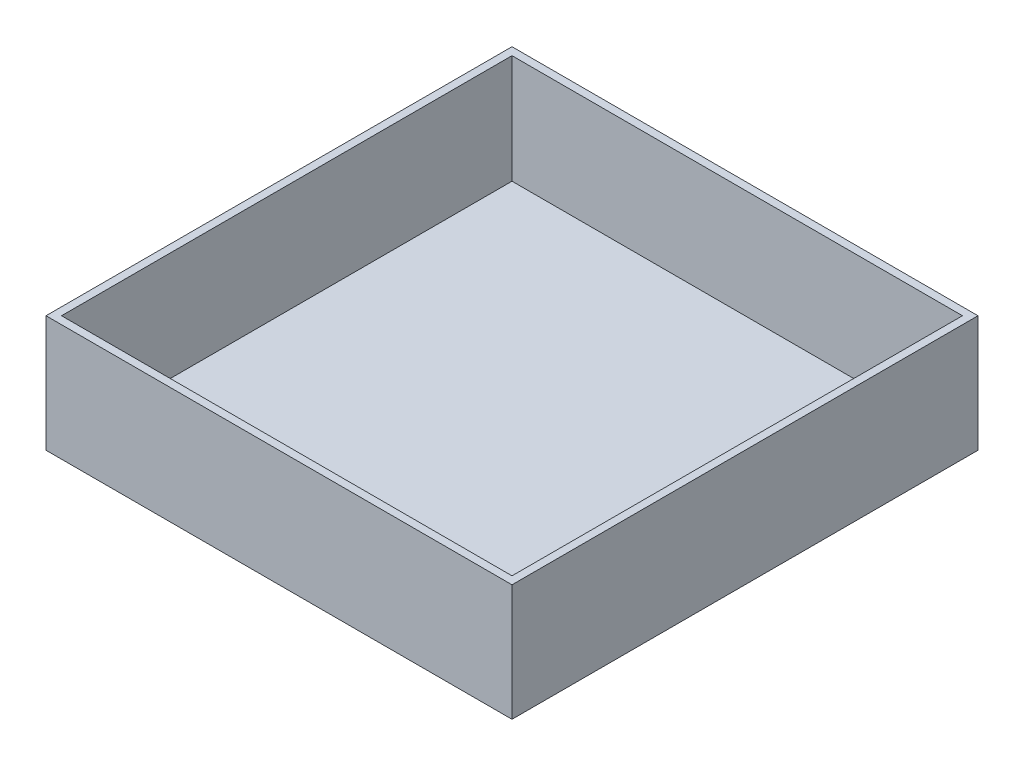
ISO-10303-21;
HEADER;
FILE_DESCRIPTION(('STEP AP214'),'2;1');
FILE_NAME('part.step','',(''),(''),'','','');
FILE_SCHEMA(('AUTOMOTIVE_DESIGN { 1 0 10303 214 1 1 1 1 }'));
ENDSEC;
DATA;
#1=APPLICATION_CONTEXT('core data for automotive mechanical design processes');
#2=APPLICATION_PROTOCOL_DEFINITION('international standard','automotive_design',2000,#1);
#3=PRODUCT_CONTEXT('',#1,'mechanical');
#4=PRODUCT('Part','Part','',(#3));
#5=PRODUCT_RELATED_PRODUCT_CATEGORY('part','',(#4));
#6=PRODUCT_DEFINITION_FORMATION('','',#4);
#7=PRODUCT_DEFINITION_CONTEXT('part definition',#1,'design');
#8=PRODUCT_DEFINITION('design','',#6,#7);
#9=PRODUCT_DEFINITION_SHAPE('','',#8);
#10=(LENGTH_UNIT() NAMED_UNIT(*) SI_UNIT(.MILLI.,.METRE.));
#11=(NAMED_UNIT(*) PLANE_ANGLE_UNIT() SI_UNIT($,.RADIAN.));
#12=(NAMED_UNIT(*) SI_UNIT($,.STERADIAN.) SOLID_ANGLE_UNIT());
#13=UNCERTAINTY_MEASURE_WITH_UNIT(LENGTH_MEASURE(1.E-05),#10,'distance_accuracy_value','');
#14=(GEOMETRIC_REPRESENTATION_CONTEXT(3) GLOBAL_UNCERTAINTY_ASSIGNED_CONTEXT((#13)) GLOBAL_UNIT_ASSIGNED_CONTEXT((#10,
#11,#12)) REPRESENTATION_CONTEXT('',''));
#15=CARTESIAN_POINT('',(0.,0.,0.));
#16=DIRECTION('',(0.,0.,1.));
#17=DIRECTION('',(1.,0.,0.));
#18=AXIS2_PLACEMENT_3D('',#15,#16,#17);
#19=CARTESIAN_POINT('',(0.,1.,0.));
#20=DIRECTION('',(1.,0.,0.));
#21=DIRECTION('',(0.,0.,-1.));
#22=AXIS2_PLACEMENT_3D('',#19,#20,#21);
#23=PLANE('',#22);
#24=DIRECTION('',(0.,0.,1.));
#25=VECTOR('',#24,1.);
#26=CARTESIAN_POINT('',(0.,0.,0.));
#27=LINE('',#26,#25);
#28=CARTESIAN_POINT('',(0.,0.,-60.0000000000001));
#29=VERTEX_POINT('',#28);
#30=CARTESIAN_POINT('',(0.,0.,0.));
#31=VERTEX_POINT('',#30);
#32=EDGE_CURVE('E173',#29,#31,#27,.T.);
#33=ORIENTED_EDGE('',*,*,#32,.T.);
#34=DIRECTION('',(0.,-1.,0.));
#35=VECTOR('',#34,1.);
#36=CARTESIAN_POINT('',(0.,1.,0.));
#37=LINE('',#36,#35);
#38=CARTESIAN_POINT('',(0.,15.,0.));
#39=VERTEX_POINT('',#38);
#40=EDGE_CURVE('E11',#39,#31,#37,.T.);
#41=ORIENTED_EDGE('',*,*,#40,.F.);
#42=DIRECTION('',(0.,0.,1.));
#43=VECTOR('',#42,1.);
#44=CARTESIAN_POINT('',(0.,15.,-60.0000000000001));
#45=LINE('',#44,#43);
#46=CARTESIAN_POINT('',(0.,15.,-60.0000000000001));
#47=VERTEX_POINT('',#46);
#48=EDGE_CURVE('E161',#47,#39,#45,.T.);
#49=ORIENTED_EDGE('',*,*,#48,.F.);
#50=DIRECTION('',(0.,-1.,0.));
#51=VECTOR('',#50,1.);
#52=CARTESIAN_POINT('',(0.,1.,-60.0000000000001));
#53=LINE('',#52,#51);
#54=EDGE_CURVE('E185',#47,#29,#53,.T.);
#55=ORIENTED_EDGE('',*,*,#54,.T.);
#56=EDGE_LOOP('',(#33,#41,#49,#55));
#57=FACE_BOUND('',#56,.T.);
#58=ADVANCED_FACE('F39',(#57),#23,.F.);
#59=CARTESIAN_POINT('',(0.,1.,0.));
#60=DIRECTION('',(0.,0.,-1.));
#61=DIRECTION('',(-1.,0.,0.));
#62=AXIS2_PLACEMENT_3D('',#59,#60,#61);
#63=PLANE('',#62);
#64=DIRECTION('',(1.,0.,0.));
#65=VECTOR('',#64,1.);
#66=CARTESIAN_POINT('',(0.,0.,0.));
#67=LINE('',#66,#65);
#68=CARTESIAN_POINT('',(60.0000000000001,0.,0.));
#69=VERTEX_POINT('',#68);
#70=EDGE_CURVE('E177',#31,#69,#67,.T.);
#71=ORIENTED_EDGE('',*,*,#70,.T.);
#72=DIRECTION('',(0.,-1.,0.));
#73=VECTOR('',#72,1.);
#74=CARTESIAN_POINT('',(60.0000000000001,1.,0.));
#75=LINE('',#74,#73);
#76=CARTESIAN_POINT('',(60.0000000000001,15.,0.));
#77=VERTEX_POINT('',#76);
#78=EDGE_CURVE('E47',#77,#69,#75,.T.);
#79=ORIENTED_EDGE('',*,*,#78,.F.);
#80=DIRECTION('',(1.,0.,0.));
#81=VECTOR('',#80,1.);
#82=CARTESIAN_POINT('',(0.,15.,0.));
#83=LINE('',#82,#81);
#84=EDGE_CURVE('E165',#39,#77,#83,.T.);
#85=ORIENTED_EDGE('',*,*,#84,.F.);
#86=ORIENTED_EDGE('',*,*,#40,.T.);
#87=EDGE_LOOP('',(#71,#79,#85,#86));
#88=FACE_BOUND('',#87,.T.);
#89=ADVANCED_FACE('F206',(#88),#63,.F.);
#90=CARTESIAN_POINT('',(60.0000000000001,1.,0.));
#91=DIRECTION('',(-1.,0.,0.));
#92=DIRECTION('',(0.,0.,1.));
#93=AXIS2_PLACEMENT_3D('',#90,#91,#92);
#94=PLANE('',#93);
#95=DIRECTION('',(0.,0.,-1.));
#96=VECTOR('',#95,1.);
#97=CARTESIAN_POINT('',(60.0000000000001,0.,0.));
#98=LINE('',#97,#96);
#99=CARTESIAN_POINT('',(60.,0.,-60.0000000000001));
#100=VERTEX_POINT('',#99);
#101=EDGE_CURVE('E180',#69,#100,#98,.T.);
#102=ORIENTED_EDGE('',*,*,#101,.T.);
#103=DIRECTION('',(0.,-1.,0.));
#104=VECTOR('',#103,1.);
#105=CARTESIAN_POINT('',(60.,1.,-60.0000000000001));
#106=LINE('',#105,#104);
#107=CARTESIAN_POINT('',(60.,15.,-60.0000000000001));
#108=VERTEX_POINT('',#107);
#109=EDGE_CURVE('E188',#108,#100,#106,.T.);
#110=ORIENTED_EDGE('',*,*,#109,.F.);
#111=DIRECTION('',(0.,0.,-1.));
#112=VECTOR('',#111,1.);
#113=CARTESIAN_POINT('',(60.0000000000001,15.,0.));
#114=LINE('',#113,#112);
#115=EDGE_CURVE('E169',#77,#108,#114,.T.);
#116=ORIENTED_EDGE('',*,*,#115,.F.);
#117=ORIENTED_EDGE('',*,*,#78,.T.);
#118=EDGE_LOOP('',(#102,#110,#116,#117));
#119=FACE_BOUND('',#118,.T.);
#120=ADVANCED_FACE('F195',(#119),#94,.F.);
#121=CARTESIAN_POINT('',(0.,1.,-60.0000000000001));
#122=DIRECTION('',(0.,0.,1.));
#123=DIRECTION('',(1.,0.,0.));
#124=AXIS2_PLACEMENT_3D('',#121,#122,#123);
#125=PLANE('',#124);
#126=DIRECTION('',(-1.,0.,0.));
#127=VECTOR('',#126,1.);
#128=CARTESIAN_POINT('',(0.,0.,-60.0000000000001));
#129=LINE('',#128,#127);
#130=EDGE_CURVE('E62',#100,#29,#129,.T.);
#131=ORIENTED_EDGE('',*,*,#130,.T.);
#132=ORIENTED_EDGE('',*,*,#54,.F.);
#133=DIRECTION('',(-1.,0.,0.));
#134=VECTOR('',#133,1.);
#135=CARTESIAN_POINT('',(60.,15.,-60.0000000000001));
#136=LINE('',#135,#134);
#137=EDGE_CURVE('E124',#108,#47,#136,.T.);
#138=ORIENTED_EDGE('',*,*,#137,.F.);
#139=ORIENTED_EDGE('',*,*,#109,.T.);
#140=EDGE_LOOP('',(#131,#132,#138,#139));
#141=FACE_BOUND('',#140,.T.);
#142=ADVANCED_FACE('F204',(#141),#125,.F.);
#143=CARTESIAN_POINT('',(0.,0.,0.));
#144=DIRECTION('',(0.,-1.,0.));
#145=DIRECTION('',(0.,0.,-1.));
#146=AXIS2_PLACEMENT_3D('',#143,#144,#145);
#147=PLANE('',#146);
#148=ORIENTED_EDGE('',*,*,#32,.F.);
#149=ORIENTED_EDGE('',*,*,#130,.F.);
#150=ORIENTED_EDGE('',*,*,#101,.F.);
#151=ORIENTED_EDGE('',*,*,#70,.F.);
#152=EDGE_LOOP('',(#148,#149,#150,#151));
#153=FACE_BOUND('',#152,.T.);
#154=ADVANCED_FACE('F200',(#153),#147,.T.);
#155=CARTESIAN_POINT('',(0.,15.,0.));
#156=DIRECTION('',(0.,1.,0.));
#157=DIRECTION('',(0.,0.,1.));
#158=AXIS2_PLACEMENT_3D('',#155,#156,#157);
#159=PLANE('',#158);
#160=ORIENTED_EDGE('',*,*,#137,.T.);
#161=ORIENTED_EDGE('',*,*,#48,.T.);
#162=ORIENTED_EDGE('',*,*,#84,.T.);
#163=ORIENTED_EDGE('',*,*,#115,.T.);
#164=EDGE_LOOP('',(#160,#161,#162,#163));
#165=FACE_BOUND('',#164,.T.);
#166=DIRECTION('',(0.,0.,1.));
#167=VECTOR('',#166,1.);
#168=CARTESIAN_POINT('',(1.00000000000003,15.,-59.));
#169=LINE('',#168,#167);
#170=CARTESIAN_POINT('',(1.00000000000003,15.,-59.));
#171=VERTEX_POINT('',#170);
#172=CARTESIAN_POINT('',(1.,15.,-1.));
#173=VERTEX_POINT('',#172);
#174=EDGE_CURVE('E115',#171,#173,#169,.T.);
#175=ORIENTED_EDGE('',*,*,#174,.F.);
#176=DIRECTION('',(-1.,0.,0.));
#177=VECTOR('',#176,1.);
#178=CARTESIAN_POINT('',(59.,15.,-59.));
#179=LINE('',#178,#177);
#180=CARTESIAN_POINT('',(59.,15.,-59.));
#181=VERTEX_POINT('',#180);
#182=EDGE_CURVE('E106',#181,#171,#179,.T.);
#183=ORIENTED_EDGE('',*,*,#182,.F.);
#184=DIRECTION('',(0.,0.,-1.));
#185=VECTOR('',#184,1.);
#186=CARTESIAN_POINT('',(59.,15.,-1.));
#187=LINE('',#186,#185);
#188=CARTESIAN_POINT('',(59.,15.,-1.));
#189=VERTEX_POINT('',#188);
#190=EDGE_CURVE('E134',#189,#181,#187,.T.);
#191=ORIENTED_EDGE('',*,*,#190,.F.);
#192=DIRECTION('',(1.,0.,0.));
#193=VECTOR('',#192,1.);
#194=CARTESIAN_POINT('',(1.,15.,-1.));
#195=LINE('',#194,#193);
#196=EDGE_CURVE('E130',#173,#189,#195,.T.);
#197=ORIENTED_EDGE('',*,*,#196,.F.);
#198=EDGE_LOOP('',(#175,#183,#191,#197));
#199=FACE_BOUND('',#198,.T.);
#200=ADVANCED_FACE('F128',(#165,#199),#159,.T.);
#201=CARTESIAN_POINT('',(59.,15.,-59.));
#202=DIRECTION('',(0.,0.,1.));
#203=DIRECTION('',(1.,0.,0.));
#204=AXIS2_PLACEMENT_3D('',#201,#202,#203);
#205=PLANE('',#204);
#206=DIRECTION('',(-1.,0.,0.));
#207=VECTOR('',#206,1.);
#208=CARTESIAN_POINT('',(59.,1.,-59.));
#209=LINE('',#208,#207);
#210=CARTESIAN_POINT('',(59.,1.,-59.));
#211=VERTEX_POINT('',#210);
#212=CARTESIAN_POINT('',(1.00000000000003,1.,-59.));
#213=VERTEX_POINT('',#212);
#214=EDGE_CURVE('E139',#211,#213,#209,.T.);
#215=ORIENTED_EDGE('',*,*,#214,.F.);
#216=DIRECTION('',(0.,-1.,0.));
#217=VECTOR('',#216,1.);
#218=CARTESIAN_POINT('',(59.,15.,-59.));
#219=LINE('',#218,#217);
#220=EDGE_CURVE('E54',#181,#211,#219,.T.);
#221=ORIENTED_EDGE('',*,*,#220,.F.);
#222=ORIENTED_EDGE('',*,*,#182,.T.);
#223=DIRECTION('',(0.,-1.,0.));
#224=VECTOR('',#223,1.);
#225=CARTESIAN_POINT('',(1.00000000000003,15.,-59.));
#226=LINE('',#225,#224);
#227=EDGE_CURVE('E109',#171,#213,#226,.T.);
#228=ORIENTED_EDGE('',*,*,#227,.T.);
#229=EDGE_LOOP('',(#215,#221,#222,#228));
#230=FACE_BOUND('',#229,.T.);
#231=ADVANCED_FACE('F108',(#230),#205,.T.);
#232=CARTESIAN_POINT('',(1.00000000000003,15.,-59.));
#233=DIRECTION('',(1.,0.,0.));
#234=DIRECTION('',(0.,0.,-1.));
#235=AXIS2_PLACEMENT_3D('',#232,#233,#234);
#236=PLANE('',#235);
#237=DIRECTION('',(0.,0.,1.));
#238=VECTOR('',#237,1.);
#239=CARTESIAN_POINT('',(1.00000000000003,1.,-59.));
#240=LINE('',#239,#238);
#241=CARTESIAN_POINT('',(1.,1.,-1.));
#242=VERTEX_POINT('',#241);
#243=EDGE_CURVE('E122',#213,#242,#240,.T.);
#244=ORIENTED_EDGE('',*,*,#243,.F.);
#245=ORIENTED_EDGE('',*,*,#227,.F.);
#246=ORIENTED_EDGE('',*,*,#174,.T.);
#247=DIRECTION('',(0.,-1.,0.));
#248=VECTOR('',#247,1.);
#249=CARTESIAN_POINT('',(1.,15.,-1.));
#250=LINE('',#249,#248);
#251=EDGE_CURVE('E125',#173,#242,#250,.T.);
#252=ORIENTED_EDGE('',*,*,#251,.T.);
#253=EDGE_LOOP('',(#244,#245,#246,#252));
#254=FACE_BOUND('',#253,.T.);
#255=ADVANCED_FACE('F119',(#254),#236,.T.);
#256=CARTESIAN_POINT('',(1.,15.,-1.));
#257=DIRECTION('',(0.,0.,-1.));
#258=DIRECTION('',(-1.,0.,0.));
#259=AXIS2_PLACEMENT_3D('',#256,#257,#258);
#260=PLANE('',#259);
#261=DIRECTION('',(1.,0.,0.));
#262=VECTOR('',#261,1.);
#263=CARTESIAN_POINT('',(1.,1.,-1.));
#264=LINE('',#263,#262);
#265=CARTESIAN_POINT('',(59.,1.,-1.));
#266=VERTEX_POINT('',#265);
#267=EDGE_CURVE('E144',#242,#266,#264,.T.);
#268=ORIENTED_EDGE('',*,*,#267,.F.);
#269=ORIENTED_EDGE('',*,*,#251,.F.);
#270=ORIENTED_EDGE('',*,*,#196,.T.);
#271=DIRECTION('',(0.,-1.,0.));
#272=VECTOR('',#271,1.);
#273=CARTESIAN_POINT('',(59.,15.,-1.));
#274=LINE('',#273,#272);
#275=EDGE_CURVE('E153',#189,#266,#274,.T.);
#276=ORIENTED_EDGE('',*,*,#275,.T.);
#277=EDGE_LOOP('',(#268,#269,#270,#276));
#278=FACE_BOUND('',#277,.T.);
#279=ADVANCED_FACE('F229',(#278),#260,.T.);
#280=CARTESIAN_POINT('',(59.,15.,-1.));
#281=DIRECTION('',(-1.,0.,0.));
#282=DIRECTION('',(0.,0.,1.));
#283=AXIS2_PLACEMENT_3D('',#280,#281,#282);
#284=PLANE('',#283);
#285=DIRECTION('',(0.,0.,-1.));
#286=VECTOR('',#285,1.);
#287=CARTESIAN_POINT('',(59.,1.,-1.));
#288=LINE('',#287,#286);
#289=EDGE_CURVE('E116',#266,#211,#288,.T.);
#290=ORIENTED_EDGE('',*,*,#289,.F.);
#291=ORIENTED_EDGE('',*,*,#275,.F.);
#292=ORIENTED_EDGE('',*,*,#190,.T.);
#293=ORIENTED_EDGE('',*,*,#220,.T.);
#294=EDGE_LOOP('',(#290,#291,#292,#293));
#295=FACE_BOUND('',#294,.T.);
#296=ADVANCED_FACE('F221',(#295),#284,.T.);
#297=CARTESIAN_POINT('',(0.,1.,0.));
#298=DIRECTION('',(0.,-1.,0.));
#299=DIRECTION('',(0.,0.,-1.));
#300=AXIS2_PLACEMENT_3D('',#297,#298,#299);
#301=PLANE('',#300);
#302=ORIENTED_EDGE('',*,*,#289,.T.);
#303=ORIENTED_EDGE('',*,*,#214,.T.);
#304=ORIENTED_EDGE('',*,*,#243,.T.);
#305=ORIENTED_EDGE('',*,*,#267,.T.);
#306=EDGE_LOOP('',(#302,#303,#304,#305));
#307=FACE_BOUND('',#306,.T.);
#308=ADVANCED_FACE('F218',(#307),#301,.F.);
#309=CLOSED_SHELL('',(#58,#89,#120,#142,#154,#200,#231,#255,#279,#296,#308));
#310=MANIFOLD_SOLID_BREP('B2',#309);
#311=ADVANCED_BREP_SHAPE_REPRESENTATION('',(#18,#310),#14);
#312=SHAPE_DEFINITION_REPRESENTATION(#9,#311);
ENDSEC;
END-ISO-10303-21;
